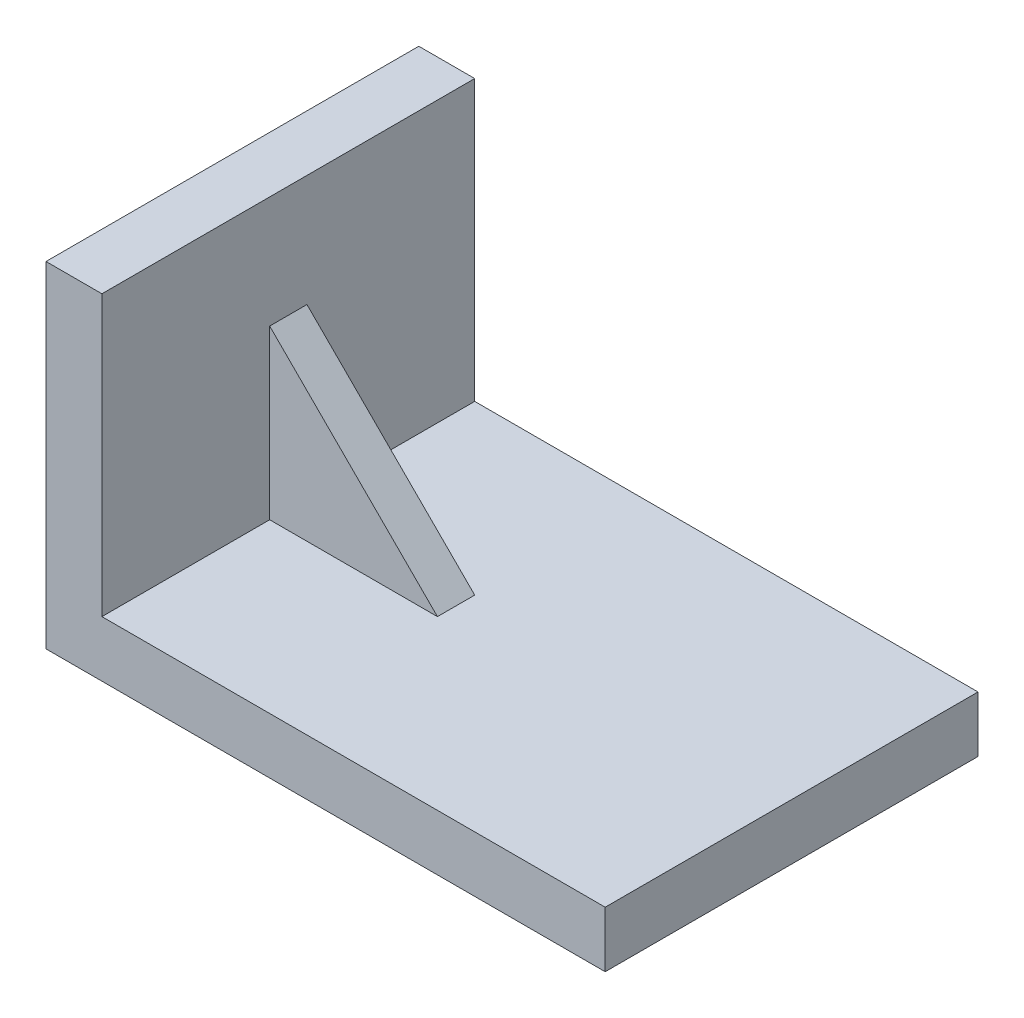
ISO-10303-21;
HEADER;
FILE_DESCRIPTION(('STEP AP214'),'2;1');
FILE_NAME('part.step','',(''),(''),'','','');
FILE_SCHEMA(('AUTOMOTIVE_DESIGN { 1 0 10303 214 1 1 1 1 }'));
ENDSEC;
DATA;
#1=APPLICATION_CONTEXT('core data for automotive mechanical design processes');
#2=APPLICATION_PROTOCOL_DEFINITION('international standard','automotive_design',2000,#1);
#3=PRODUCT_CONTEXT('',#1,'mechanical');
#4=PRODUCT('Part','Part','',(#3));
#5=PRODUCT_RELATED_PRODUCT_CATEGORY('part','',(#4));
#6=PRODUCT_DEFINITION_FORMATION('','',#4);
#7=PRODUCT_DEFINITION_CONTEXT('part definition',#1,'design');
#8=PRODUCT_DEFINITION('design','',#6,#7);
#9=PRODUCT_DEFINITION_SHAPE('','',#8);
#10=(LENGTH_UNIT() NAMED_UNIT(*) SI_UNIT(.MILLI.,.METRE.));
#11=(NAMED_UNIT(*) PLANE_ANGLE_UNIT() SI_UNIT($,.RADIAN.));
#12=(NAMED_UNIT(*) SI_UNIT($,.STERADIAN.) SOLID_ANGLE_UNIT());
#13=UNCERTAINTY_MEASURE_WITH_UNIT(LENGTH_MEASURE(1.E-05),#10,'distance_accuracy_value','');
#14=(GEOMETRIC_REPRESENTATION_CONTEXT(3) GLOBAL_UNCERTAINTY_ASSIGNED_CONTEXT((#13)) GLOBAL_UNIT_ASSIGNED_CONTEXT((#10,
#11,#12)) REPRESENTATION_CONTEXT('',''));
#15=CARTESIAN_POINT('',(0.,0.,0.));
#16=DIRECTION('',(0.,0.,1.));
#17=DIRECTION('',(1.,0.,0.));
#18=AXIS2_PLACEMENT_3D('',#15,#16,#17);
#19=CARTESIAN_POINT('',(0.,6.,0.));
#20=DIRECTION('',(0.,-1.,0.));
#21=DIRECTION('',(0.,0.,-1.));
#22=AXIS2_PLACEMENT_3D('',#19,#20,#21);
#23=PLANE('',#22);
#24=DIRECTION('',(0.,0.,-1.));
#25=VECTOR('',#24,1.);
#26=CARTESIAN_POINT('',(24.,6.,2.));
#27=LINE('',#26,#25);
#28=CARTESIAN_POINT('',(24.,6.,2.));
#29=VERTEX_POINT('',#28);
#30=CARTESIAN_POINT('',(24.,6.,-2.));
#31=VERTEX_POINT('',#30);
#32=EDGE_CURVE('E68',#29,#31,#27,.T.);
#33=ORIENTED_EDGE('',*,*,#32,.F.);
#34=DIRECTION('',(1.,0.,0.));
#35=VECTOR('',#34,1.);
#36=CARTESIAN_POINT('',(6.,6.,2.));
#37=LINE('',#36,#35);
#38=CARTESIAN_POINT('',(6.,6.,2.));
#39=VERTEX_POINT('',#38);
#40=EDGE_CURVE('E238',#39,#29,#37,.T.);
#41=ORIENTED_EDGE('',*,*,#40,.F.);
#42=DIRECTION('',(0.,0.,-1.));
#43=VECTOR('',#42,1.);
#44=CARTESIAN_POINT('',(6.,6.,0.));
#45=LINE('',#44,#43);
#46=CARTESIAN_POINT('',(6.,6.,20.));
#47=VERTEX_POINT('',#46);
#48=EDGE_CURVE('E177',#47,#39,#45,.T.);
#49=ORIENTED_EDGE('',*,*,#48,.F.);
#50=DIRECTION('',(1.,0.,0.));
#51=VECTOR('',#50,1.);
#52=CARTESIAN_POINT('',(60.,6.,20.));
#53=LINE('',#52,#51);
#54=CARTESIAN_POINT('',(60.,6.,20.));
#55=VERTEX_POINT('',#54);
#56=EDGE_CURVE('E180',#47,#55,#53,.T.);
#57=ORIENTED_EDGE('',*,*,#56,.T.);
#58=DIRECTION('',(0.,0.,-1.));
#59=VECTOR('',#58,1.);
#60=CARTESIAN_POINT('',(60.,6.,-20.));
#61=LINE('',#60,#59);
#62=CARTESIAN_POINT('',(60.,6.,-20.));
#63=VERTEX_POINT('',#62);
#64=EDGE_CURVE('E183',#55,#63,#61,.T.);
#65=ORIENTED_EDGE('',*,*,#64,.T.);
#66=DIRECTION('',(-1.,0.,0.));
#67=VECTOR('',#66,1.);
#68=CARTESIAN_POINT('',(0.,6.,-20.));
#69=LINE('',#68,#67);
#70=CARTESIAN_POINT('',(6.,6.,-20.));
#71=VERTEX_POINT('',#70);
#72=EDGE_CURVE('E186',#63,#71,#69,.T.);
#73=ORIENTED_EDGE('',*,*,#72,.T.);
#74=CARTESIAN_POINT('',(6.,6.,-2.));
#75=VERTEX_POINT('',#74);
#76=EDGE_CURVE('E176',#75,#71,#45,.T.);
#77=ORIENTED_EDGE('',*,*,#76,.F.);
#78=DIRECTION('',(1.,0.,0.));
#79=VECTOR('',#78,1.);
#80=CARTESIAN_POINT('',(6.,6.,-2.));
#81=LINE('',#80,#79);
#82=EDGE_CURVE('E73',#75,#31,#81,.T.);
#83=ORIENTED_EDGE('',*,*,#82,.T.);
#84=EDGE_LOOP('',(#33,#41,#49,#57,#65,#73,#77,#83));
#85=FACE_BOUND('',#84,.T.);
#86=ADVANCED_FACE('F51',(#85),#23,.F.);
#87=CARTESIAN_POINT('',(0.,6.,20.));
#88=DIRECTION('',(1.,0.,0.));
#89=DIRECTION('',(0.,0.,-1.));
#90=AXIS2_PLACEMENT_3D('',#87,#88,#89);
#91=PLANE('',#90);
#92=DIRECTION('',(0.,0.,1.));
#93=VECTOR('',#92,1.);
#94=CARTESIAN_POINT('',(0.,0.,20.));
#95=LINE('',#94,#93);
#96=CARTESIAN_POINT('',(0.,0.,-20.));
#97=VERTEX_POINT('',#96);
#98=CARTESIAN_POINT('',(0.,0.,20.));
#99=VERTEX_POINT('',#98);
#100=EDGE_CURVE('E179',#97,#99,#95,.T.);
#101=ORIENTED_EDGE('',*,*,#100,.T.);
#102=DIRECTION('',(0.,-1.,0.));
#103=VECTOR('',#102,1.);
#104=CARTESIAN_POINT('',(0.,6.,20.));
#105=LINE('',#104,#103);
#106=CARTESIAN_POINT('',(0.,36.,20.));
#107=VERTEX_POINT('',#106);
#108=EDGE_CURVE('E11',#107,#99,#105,.T.);
#109=ORIENTED_EDGE('',*,*,#108,.F.);
#110=DIRECTION('',(0.,0.,1.));
#111=VECTOR('',#110,1.);
#112=CARTESIAN_POINT('',(0.,36.,20.));
#113=LINE('',#112,#111);
#114=CARTESIAN_POINT('',(0.,36.,-20.));
#115=VERTEX_POINT('',#114);
#116=EDGE_CURVE('E154',#115,#107,#113,.T.);
#117=ORIENTED_EDGE('',*,*,#116,.F.);
#118=DIRECTION('',(0.,-1.,0.));
#119=VECTOR('',#118,1.);
#120=CARTESIAN_POINT('',(0.,6.,-20.));
#121=LINE('',#120,#119);
#122=EDGE_CURVE('E190',#115,#97,#121,.T.);
#123=ORIENTED_EDGE('',*,*,#122,.T.);
#124=EDGE_LOOP('',(#101,#109,#117,#123));
#125=FACE_BOUND('',#124,.T.);
#126=ADVANCED_FACE('F54',(#125),#91,.F.);
#127=CARTESIAN_POINT('',(60.,6.,20.));
#128=DIRECTION('',(0.,0.,-1.));
#129=DIRECTION('',(-1.,0.,0.));
#130=AXIS2_PLACEMENT_3D('',#127,#128,#129);
#131=PLANE('',#130);
#132=DIRECTION('',(1.,0.,0.));
#133=VECTOR('',#132,1.);
#134=CARTESIAN_POINT('',(60.,0.,20.));
#135=LINE('',#134,#133);
#136=CARTESIAN_POINT('',(60.,0.,20.));
#137=VERTEX_POINT('',#136);
#138=EDGE_CURVE('E194',#99,#137,#135,.T.);
#139=ORIENTED_EDGE('',*,*,#138,.T.);
#140=DIRECTION('',(0.,-1.,0.));
#141=VECTOR('',#140,1.);
#142=CARTESIAN_POINT('',(60.,6.,20.));
#143=LINE('',#142,#141);
#144=EDGE_CURVE('E61',#55,#137,#143,.T.);
#145=ORIENTED_EDGE('',*,*,#144,.F.);
#146=ORIENTED_EDGE('',*,*,#56,.F.);
#147=DIRECTION('',(0.,-1.,0.));
#148=VECTOR('',#147,1.);
#149=CARTESIAN_POINT('',(6.,0.,20.));
#150=LINE('',#149,#148);
#151=CARTESIAN_POINT('',(6.,36.,20.));
#152=VERTEX_POINT('',#151);
#153=EDGE_CURVE('E161',#152,#47,#150,.T.);
#154=ORIENTED_EDGE('',*,*,#153,.F.);
#155=DIRECTION('',(-1.,0.,0.));
#156=VECTOR('',#155,1.);
#157=CARTESIAN_POINT('',(6.,36.,20.));
#158=LINE('',#157,#156);
#159=EDGE_CURVE('E165',#152,#107,#158,.T.);
#160=ORIENTED_EDGE('',*,*,#159,.T.);
#161=ORIENTED_EDGE('',*,*,#108,.T.);
#162=EDGE_LOOP('',(#139,#145,#146,#154,#160,#161));
#163=FACE_BOUND('',#162,.T.);
#164=ADVANCED_FACE('F235',(#163),#131,.F.);
#165=CARTESIAN_POINT('',(60.,6.,-20.));
#166=DIRECTION('',(-1.,0.,0.));
#167=DIRECTION('',(0.,0.,1.));
#168=AXIS2_PLACEMENT_3D('',#165,#166,#167);
#169=PLANE('',#168);
#170=DIRECTION('',(0.,0.,-1.));
#171=VECTOR('',#170,1.);
#172=CARTESIAN_POINT('',(60.,0.,-20.));
#173=LINE('',#172,#171);
#174=CARTESIAN_POINT('',(60.,0.,-20.));
#175=VERTEX_POINT('',#174);
#176=EDGE_CURVE('E197',#137,#175,#173,.T.);
#177=ORIENTED_EDGE('',*,*,#176,.T.);
#178=DIRECTION('',(0.,-1.,0.));
#179=VECTOR('',#178,1.);
#180=CARTESIAN_POINT('',(60.,6.,-20.));
#181=LINE('',#180,#179);
#182=EDGE_CURVE('E205',#63,#175,#181,.T.);
#183=ORIENTED_EDGE('',*,*,#182,.F.);
#184=ORIENTED_EDGE('',*,*,#64,.F.);
#185=ORIENTED_EDGE('',*,*,#144,.T.);
#186=EDGE_LOOP('',(#177,#183,#184,#185));
#187=FACE_BOUND('',#186,.T.);
#188=ADVANCED_FACE('F214',(#187),#169,.F.);
#189=CARTESIAN_POINT('',(0.,6.,-20.));
#190=DIRECTION('',(0.,0.,1.));
#191=DIRECTION('',(1.,0.,0.));
#192=AXIS2_PLACEMENT_3D('',#189,#190,#191);
#193=PLANE('',#192);
#194=ORIENTED_EDGE('',*,*,#122,.F.);
#195=DIRECTION('',(-1.,0.,0.));
#196=VECTOR('',#195,1.);
#197=CARTESIAN_POINT('',(6.,36.,-20.));
#198=LINE('',#197,#196);
#199=CARTESIAN_POINT('',(6.,36.,-20.));
#200=VERTEX_POINT('',#199);
#201=EDGE_CURVE('E172',#200,#115,#198,.T.);
#202=ORIENTED_EDGE('',*,*,#201,.F.);
#203=DIRECTION('',(0.,1.,0.));
#204=VECTOR('',#203,1.);
#205=CARTESIAN_POINT('',(6.,36.,-20.));
#206=LINE('',#205,#204);
#207=EDGE_CURVE('E155',#71,#200,#206,.T.);
#208=ORIENTED_EDGE('',*,*,#207,.F.);
#209=ORIENTED_EDGE('',*,*,#72,.F.);
#210=ORIENTED_EDGE('',*,*,#182,.T.);
#211=DIRECTION('',(-1.,0.,0.));
#212=VECTOR('',#211,1.);
#213=CARTESIAN_POINT('',(0.,0.,-20.));
#214=LINE('',#213,#212);
#215=EDGE_CURVE('E184',#175,#97,#214,.T.);
#216=ORIENTED_EDGE('',*,*,#215,.T.);
#217=EDGE_LOOP('',(#194,#202,#208,#209,#210,#216));
#218=FACE_BOUND('',#217,.T.);
#219=ADVANCED_FACE('F223',(#218),#193,.F.);
#220=CARTESIAN_POINT('',(0.,0.,0.));
#221=DIRECTION('',(0.,-1.,0.));
#222=DIRECTION('',(0.,0.,-1.));
#223=AXIS2_PLACEMENT_3D('',#220,#221,#222);
#224=PLANE('',#223);
#225=ORIENTED_EDGE('',*,*,#100,.F.);
#226=ORIENTED_EDGE('',*,*,#215,.F.);
#227=ORIENTED_EDGE('',*,*,#176,.F.);
#228=ORIENTED_EDGE('',*,*,#138,.F.);
#229=EDGE_LOOP('',(#225,#226,#227,#228));
#230=FACE_BOUND('',#229,.T.);
#231=ADVANCED_FACE('F221',(#230),#224,.T.);
#232=CARTESIAN_POINT('',(6.,0.,0.));
#233=DIRECTION('',(-1.,0.,0.));
#234=DIRECTION('',(0.,0.,1.));
#235=AXIS2_PLACEMENT_3D('',#232,#233,#234);
#236=PLANE('',#235);
#237=ORIENTED_EDGE('',*,*,#48,.T.);
#238=DIRECTION('',(0.,-1.,0.));
#239=VECTOR('',#238,1.);
#240=CARTESIAN_POINT('',(6.,24.,2.));
#241=LINE('',#240,#239);
#242=CARTESIAN_POINT('',(6.,24.,2.));
#243=VERTEX_POINT('',#242);
#244=EDGE_CURVE('E129',#243,#39,#241,.T.);
#245=ORIENTED_EDGE('',*,*,#244,.F.);
#246=DIRECTION('',(0.,0.,-1.));
#247=VECTOR('',#246,1.);
#248=CARTESIAN_POINT('',(6.,24.,2.));
#249=LINE('',#248,#247);
#250=CARTESIAN_POINT('',(6.,24.,-2.));
#251=VERTEX_POINT('',#250);
#252=EDGE_CURVE('E122',#243,#251,#249,.T.);
#253=ORIENTED_EDGE('',*,*,#252,.T.);
#254=DIRECTION('',(0.,-1.,0.));
#255=VECTOR('',#254,1.);
#256=CARTESIAN_POINT('',(6.,24.,-2.));
#257=LINE('',#256,#255);
#258=EDGE_CURVE('E127',#251,#75,#257,.T.);
#259=ORIENTED_EDGE('',*,*,#258,.T.);
#260=ORIENTED_EDGE('',*,*,#76,.T.);
#261=ORIENTED_EDGE('',*,*,#207,.T.);
#262=DIRECTION('',(0.,0.,1.));
#263=VECTOR('',#262,1.);
#264=CARTESIAN_POINT('',(6.,36.,20.));
#265=LINE('',#264,#263);
#266=EDGE_CURVE('E158',#200,#152,#265,.T.);
#267=ORIENTED_EDGE('',*,*,#266,.T.);
#268=ORIENTED_EDGE('',*,*,#153,.T.);
#269=EDGE_LOOP('',(#237,#245,#253,#259,#260,#261,#267,#268));
#270=FACE_BOUND('',#269,.T.);
#271=ADVANCED_FACE('F125',(#270),#236,.F.);
#272=CARTESIAN_POINT('',(6.,36.,20.));
#273=DIRECTION('',(0.,-1.,0.));
#274=DIRECTION('',(0.,0.,-1.));
#275=AXIS2_PLACEMENT_3D('',#272,#273,#274);
#276=PLANE('',#275);
#277=ORIENTED_EDGE('',*,*,#116,.T.);
#278=ORIENTED_EDGE('',*,*,#159,.F.);
#279=ORIENTED_EDGE('',*,*,#266,.F.);
#280=ORIENTED_EDGE('',*,*,#201,.T.);
#281=EDGE_LOOP('',(#277,#278,#279,#280));
#282=FACE_BOUND('',#281,.T.);
#283=ADVANCED_FACE('F231',(#282),#276,.F.);
#284=CARTESIAN_POINT('',(24.,6.,2.));
#285=DIRECTION('',(-0.707106781186547,-0.707106781186547,0.));
#286=DIRECTION('',(0.707106781186548,-0.707106781186548,0.));
#287=AXIS2_PLACEMENT_3D('',#284,#285,#286);
#288=PLANE('',#287);
#289=DIRECTION('',(-0.707106781186547,0.707106781186547,0.));
#290=VECTOR('',#289,1.);
#291=CARTESIAN_POINT('',(24.,6.,-2.));
#292=LINE('',#291,#290);
#293=EDGE_CURVE('E137',#31,#251,#292,.T.);
#294=ORIENTED_EDGE('',*,*,#293,.T.);
#295=ORIENTED_EDGE('',*,*,#252,.F.);
#296=DIRECTION('',(-0.707106781186547,0.707106781186547,0.));
#297=VECTOR('',#296,1.);
#298=CARTESIAN_POINT('',(24.,6.,2.));
#299=LINE('',#298,#297);
#300=EDGE_CURVE('E134',#29,#243,#299,.T.);
#301=ORIENTED_EDGE('',*,*,#300,.F.);
#302=ORIENTED_EDGE('',*,*,#32,.T.);
#303=EDGE_LOOP('',(#294,#295,#301,#302));
#304=FACE_BOUND('',#303,.T.);
#305=ADVANCED_FACE('F138',(#304),#288,.F.);
#306=CARTESIAN_POINT('',(0.,0.,2.));
#307=DIRECTION('',(0.,0.,1.));
#308=DIRECTION('',(1.,0.,0.));
#309=AXIS2_PLACEMENT_3D('',#306,#307,#308);
#310=PLANE('',#309);
#311=ORIENTED_EDGE('',*,*,#244,.T.);
#312=ORIENTED_EDGE('',*,*,#40,.T.);
#313=ORIENTED_EDGE('',*,*,#300,.T.);
#314=EDGE_LOOP('',(#311,#312,#313));
#315=FACE_BOUND('',#314,.T.);
#316=ADVANCED_FACE('F237',(#315),#310,.T.);
#317=CARTESIAN_POINT('',(0.,0.,-2.));
#318=DIRECTION('',(0.,0.,1.));
#319=DIRECTION('',(1.,0.,0.));
#320=AXIS2_PLACEMENT_3D('',#317,#318,#319);
#321=PLANE('',#320);
#322=ORIENTED_EDGE('',*,*,#258,.F.);
#323=ORIENTED_EDGE('',*,*,#293,.F.);
#324=ORIENTED_EDGE('',*,*,#82,.F.);
#325=EDGE_LOOP('',(#322,#323,#324));
#326=FACE_BOUND('',#325,.T.);
#327=ADVANCED_FACE('F142',(#326),#321,.F.);
#328=CLOSED_SHELL('',(#86,#126,#164,#188,#219,#231,#271,#283,#305,#316,#327));
#329=MANIFOLD_SOLID_BREP('B2',#328);
#330=ADVANCED_BREP_SHAPE_REPRESENTATION('',(#18,#329),#14);
#331=SHAPE_DEFINITION_REPRESENTATION(#9,#330);
ENDSEC;
END-ISO-10303-21;
